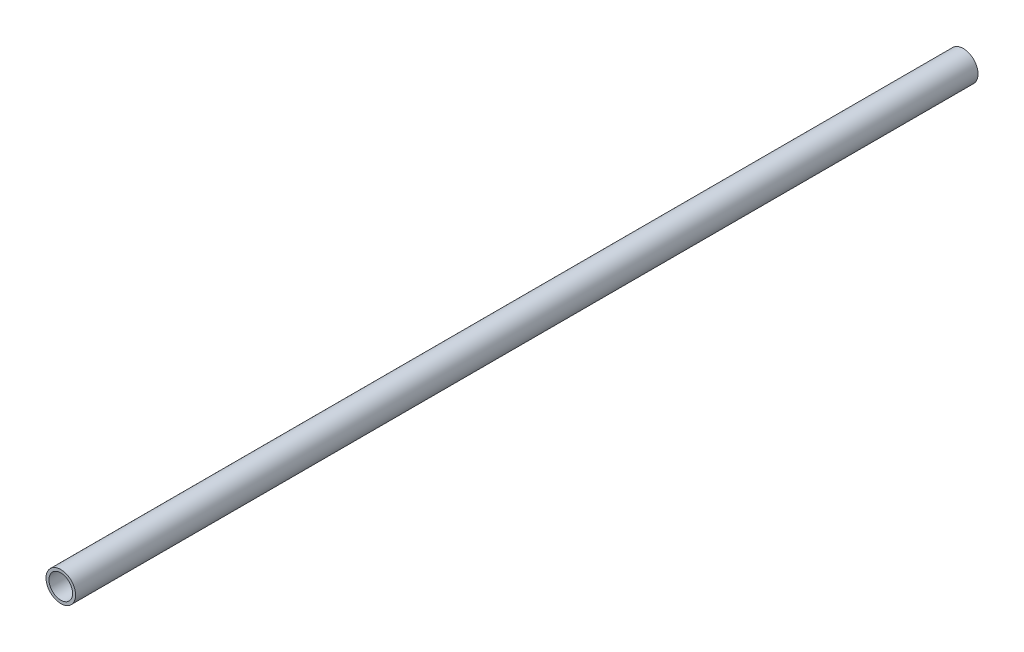
ISO-10303-21;
HEADER;
FILE_DESCRIPTION(('STEP AP214'),'2;1');
FILE_NAME('part.step','',(''),(''),'','','');
FILE_SCHEMA(('AUTOMOTIVE_DESIGN { 1 0 10303 214 1 1 1 1 }'));
ENDSEC;
DATA;
#1=APPLICATION_CONTEXT('core data for automotive mechanical design processes');
#2=APPLICATION_PROTOCOL_DEFINITION('international standard','automotive_design',2000,#1);
#3=PRODUCT_CONTEXT('',#1,'mechanical');
#4=PRODUCT('Part','Part','',(#3));
#5=PRODUCT_RELATED_PRODUCT_CATEGORY('part','',(#4));
#6=PRODUCT_DEFINITION_FORMATION('','',#4);
#7=PRODUCT_DEFINITION_CONTEXT('part definition',#1,'design');
#8=PRODUCT_DEFINITION('design','',#6,#7);
#9=PRODUCT_DEFINITION_SHAPE('','',#8);
#10=(LENGTH_UNIT() NAMED_UNIT(*) SI_UNIT(.MILLI.,.METRE.));
#11=(NAMED_UNIT(*) PLANE_ANGLE_UNIT() SI_UNIT($,.RADIAN.));
#12=(NAMED_UNIT(*) SI_UNIT($,.STERADIAN.) SOLID_ANGLE_UNIT());
#13=UNCERTAINTY_MEASURE_WITH_UNIT(LENGTH_MEASURE(1.E-05),#10,'distance_accuracy_value','');
#14=(GEOMETRIC_REPRESENTATION_CONTEXT(3) GLOBAL_UNCERTAINTY_ASSIGNED_CONTEXT((#13)) GLOBAL_UNIT_ASSIGNED_CONTEXT((#10,
#11,#12)) REPRESENTATION_CONTEXT('',''));
#15=CARTESIAN_POINT('',(0.,0.,0.));
#16=DIRECTION('',(0.,0.,1.));
#17=DIRECTION('',(1.,0.,0.));
#18=AXIS2_PLACEMENT_3D('',#15,#16,#17);
#19=CARTESIAN_POINT('',(0.,0.,458.));
#20=DIRECTION('',(0.,0.,1.));
#21=DIRECTION('',(1.,0.,0.));
#22=AXIS2_PLACEMENT_3D('',#19,#20,#21);
#23=PLANE('',#22);
#24=CARTESIAN_POINT('',(0.,0.,458.));
#25=DIRECTION('',(0.,0.,1.));
#26=DIRECTION('',(1.,0.,0.));
#27=AXIS2_PLACEMENT_3D('',#24,#25,#26);
#28=CIRCLE('',#27,15.);
#29=CARTESIAN_POINT('',(-15.,0.,458.));
#30=VERTEX_POINT('',#29);
#31=EDGE_CURVE('E10',#30,#30,#28,.T.);
#32=ORIENTED_EDGE('',*,*,#31,.T.);
#33=EDGE_LOOP('',(#32));
#34=FACE_BOUND('',#33,.T.);
#35=CARTESIAN_POINT('',(0.,0.,458.));
#36=DIRECTION('',(0.,0.,1.));
#37=DIRECTION('',(1.,0.,0.));
#38=AXIS2_PLACEMENT_3D('',#35,#36,#37);
#39=CIRCLE('',#38,12.);
#40=CARTESIAN_POINT('',(-12.,0.,458.));
#41=VERTEX_POINT('',#40);
#42=EDGE_CURVE('E48',#41,#41,#39,.T.);
#43=ORIENTED_EDGE('',*,*,#42,.F.);
#44=EDGE_LOOP('',(#43));
#45=FACE_BOUND('',#44,.T.);
#46=ADVANCED_FACE('F37',(#34,#45),#23,.T.);
#47=CARTESIAN_POINT('',(0.,0.,-458.));
#48=DIRECTION('',(0.,0.,1.));
#49=DIRECTION('',(1.,0.,0.));
#50=AXIS2_PLACEMENT_3D('',#47,#48,#49);
#51=PLANE('',#50);
#52=CARTESIAN_POINT('',(0.,0.,-458.));
#53=DIRECTION('',(0.,0.,1.));
#54=DIRECTION('',(1.,0.,0.));
#55=AXIS2_PLACEMENT_3D('',#52,#53,#54);
#56=CIRCLE('',#55,15.);
#57=CARTESIAN_POINT('',(-15.,0.,-458.));
#58=VERTEX_POINT('',#57);
#59=EDGE_CURVE('E41',#58,#58,#56,.T.);
#60=ORIENTED_EDGE('',*,*,#59,.F.);
#61=EDGE_LOOP('',(#60));
#62=FACE_BOUND('',#61,.T.);
#63=CARTESIAN_POINT('',(0.,0.,-458.));
#64=DIRECTION('',(0.,0.,1.));
#65=DIRECTION('',(1.,0.,0.));
#66=AXIS2_PLACEMENT_3D('',#63,#64,#65);
#67=CIRCLE('',#66,12.);
#68=CARTESIAN_POINT('',(-12.,0.,-458.));
#69=VERTEX_POINT('',#68);
#70=EDGE_CURVE('E50',#69,#69,#67,.T.);
#71=ORIENTED_EDGE('',*,*,#70,.T.);
#72=EDGE_LOOP('',(#71));
#73=FACE_BOUND('',#72,.T.);
#74=ADVANCED_FACE('F60',(#62,#73),#51,.F.);
#75=CARTESIAN_POINT('',(0.,0.,458.));
#76=DIRECTION('',(0.,0.,-1.));
#77=DIRECTION('',(-1.,0.,0.));
#78=AXIS2_PLACEMENT_3D('',#75,#76,#77);
#79=CYLINDRICAL_SURFACE('',#78,15.);
#80=CARTESIAN_POINT('',(-15.,0.,458.));
#81=CARTESIAN_POINT('',(-15.,0.,448.458333333333));
#82=CARTESIAN_POINT('',(-15.,0.,438.916666666667));
#83=CARTESIAN_POINT('',(-15.,0.,419.833333333333));
#84=CARTESIAN_POINT('',(-15.,0.,410.291666666667));
#85=CARTESIAN_POINT('',(-15.,0.,391.208333333333));
#86=CARTESIAN_POINT('',(-15.,0.,381.666666666667));
#87=CARTESIAN_POINT('',(-15.,0.,362.583333333333));
#88=CARTESIAN_POINT('',(-15.,0.,353.041666666667));
#89=CARTESIAN_POINT('',(-15.,0.,333.958333333333));
#90=CARTESIAN_POINT('',(-15.,0.,324.416666666667));
#91=CARTESIAN_POINT('',(-15.,0.,305.333333333333));
#92=CARTESIAN_POINT('',(-15.,0.,295.791666666667));
#93=CARTESIAN_POINT('',(-15.,0.,276.708333333333));
#94=CARTESIAN_POINT('',(-15.,0.,267.166666666667));
#95=CARTESIAN_POINT('',(-15.,0.,248.083333333333));
#96=CARTESIAN_POINT('',(-15.,0.,238.541666666667));
#97=CARTESIAN_POINT('',(-15.,0.,219.458333333333));
#98=CARTESIAN_POINT('',(-15.,0.,209.916666666667));
#99=CARTESIAN_POINT('',(-15.,0.,190.833333333333));
#100=CARTESIAN_POINT('',(-15.,0.,181.291666666667));
#101=CARTESIAN_POINT('',(-15.,0.,162.208333333333));
#102=CARTESIAN_POINT('',(-15.,0.,152.666666666667));
#103=CARTESIAN_POINT('',(-15.,0.,133.583333333333));
#104=CARTESIAN_POINT('',(-15.,0.,124.041666666667));
#105=CARTESIAN_POINT('',(-15.,0.,104.958333333333));
#106=CARTESIAN_POINT('',(-15.,0.,95.4166666666667));
#107=CARTESIAN_POINT('',(-15.,0.,76.3333333333334));
#108=CARTESIAN_POINT('',(-15.,0.,66.7916666666667));
#109=CARTESIAN_POINT('',(-15.,0.,47.7083333333333));
#110=CARTESIAN_POINT('',(-15.,0.,38.1666666666667));
#111=CARTESIAN_POINT('',(-15.,0.,19.0833333333333));
#112=CARTESIAN_POINT('',(-15.,0.,9.54166666666667));
#113=CARTESIAN_POINT('',(-15.,0.,-9.54166666666667));
#114=CARTESIAN_POINT('',(-15.,0.,-19.0833333333333));
#115=CARTESIAN_POINT('',(-15.,0.,-38.1666666666667));
#116=CARTESIAN_POINT('',(-15.,0.,-47.7083333333333));
#117=CARTESIAN_POINT('',(-15.,0.,-66.7916666666666));
#118=CARTESIAN_POINT('',(-15.,0.,-76.3333333333333));
#119=CARTESIAN_POINT('',(-15.,0.,-95.4166666666666));
#120=CARTESIAN_POINT('',(-15.,0.,-104.958333333333));
#121=CARTESIAN_POINT('',(-15.,0.,-124.041666666667));
#122=CARTESIAN_POINT('',(-15.,0.,-133.583333333333));
#123=CARTESIAN_POINT('',(-15.,0.,-152.666666666667));
#124=CARTESIAN_POINT('',(-15.,0.,-162.208333333333));
#125=CARTESIAN_POINT('',(-15.,0.,-181.291666666667));
#126=CARTESIAN_POINT('',(-15.,0.,-190.833333333333));
#127=CARTESIAN_POINT('',(-15.,0.,-209.916666666667));
#128=CARTESIAN_POINT('',(-15.,0.,-219.458333333333));
#129=CARTESIAN_POINT('',(-15.,0.,-238.541666666667));
#130=CARTESIAN_POINT('',(-15.,0.,-248.083333333333));
#131=CARTESIAN_POINT('',(-15.,0.,-267.166666666667));
#132=CARTESIAN_POINT('',(-15.,0.,-276.708333333333));
#133=CARTESIAN_POINT('',(-15.,0.,-295.791666666667));
#134=CARTESIAN_POINT('',(-15.,0.,-305.333333333333));
#135=CARTESIAN_POINT('',(-15.,0.,-324.416666666667));
#136=CARTESIAN_POINT('',(-15.,0.,-333.958333333333));
#137=CARTESIAN_POINT('',(-15.,0.,-353.041666666667));
#138=CARTESIAN_POINT('',(-15.,0.,-362.583333333333));
#139=CARTESIAN_POINT('',(-15.,0.,-381.666666666667));
#140=CARTESIAN_POINT('',(-15.,0.,-391.208333333333));
#141=CARTESIAN_POINT('',(-15.,0.,-410.291666666667));
#142=CARTESIAN_POINT('',(-15.,0.,-419.833333333333));
#143=CARTESIAN_POINT('',(-15.,0.,-438.916666666667));
#144=CARTESIAN_POINT('',(-15.,0.,-448.458333333333));
#145=CARTESIAN_POINT('',(-15.,0.,-458.));
#146=B_SPLINE_CURVE_WITH_KNOTS('',3,(#80,#81,#82,#83,#84,#85,#86,#87,#88,#89,#90,#91,#92,#93,
#94,#95,#96,#97,#98,#99,#100,#101,#102,#103,#104,#105,#106,#107,#108,#109,#110,#111,#112,#113,
#114,#115,#116,#117,#118,#119,#120,#121,#122,#123,#124,#125,#126,#127,#128,#129,#130,#131,#132,
#133,#134,#135,#136,#137,#138,#139,#140,#141,#142,#143,#144,#145),.UNSPECIFIED.,.F.,.F.,(4,2,2,
2,2,2,2,2,2,2,2,2,2,2,2,2,2,2,2,2,2,2,2,2,2,2,2,2,2,2,2,2,4),(0.,28.625,57.25,85.875,114.5,
143.125,171.75,200.375,229.,257.625,286.25,314.875,343.5,372.125,400.75,429.375,458.,486.625,
515.25,543.875,572.5,601.125,629.75,658.375,687.,715.625,744.25,772.875,801.5,830.125,858.75,
887.375,916.),.UNSPECIFIED.);
#147=EDGE_CURVE('BSEAM39',#30,#58,#146,.T.);
#148=ORIENTED_EDGE('',*,*,#31,.F.);
#149=ORIENTED_EDGE('',*,*,#59,.T.);
#150=ORIENTED_EDGE('',*,*,#147,.T.);
#151=ORIENTED_EDGE('',*,*,#147,.F.);
#152=EDGE_LOOP('',(#148,#150,#149,#151));
#153=FACE_BOUND('',#152,.T.);
#154=ADVANCED_FACE('F39',(#153),#79,.T.);
#155=CARTESIAN_POINT('',(0.,0.,458.));
#156=DIRECTION('',(0.,0.,-1.));
#157=DIRECTION('',(-1.,0.,0.));
#158=AXIS2_PLACEMENT_3D('',#155,#156,#157);
#159=CYLINDRICAL_SURFACE('',#158,12.);
#160=CARTESIAN_POINT('',(-12.,0.,458.));
#161=CARTESIAN_POINT('',(-12.,0.,448.458333333333));
#162=CARTESIAN_POINT('',(-12.,0.,438.916666666667));
#163=CARTESIAN_POINT('',(-12.,0.,419.833333333333));
#164=CARTESIAN_POINT('',(-12.,0.,410.291666666667));
#165=CARTESIAN_POINT('',(-12.,0.,391.208333333333));
#166=CARTESIAN_POINT('',(-12.,0.,381.666666666667));
#167=CARTESIAN_POINT('',(-12.,0.,362.583333333333));
#168=CARTESIAN_POINT('',(-12.,0.,353.041666666667));
#169=CARTESIAN_POINT('',(-12.,0.,333.958333333333));
#170=CARTESIAN_POINT('',(-12.,0.,324.416666666667));
#171=CARTESIAN_POINT('',(-12.,0.,305.333333333333));
#172=CARTESIAN_POINT('',(-12.,0.,295.791666666667));
#173=CARTESIAN_POINT('',(-12.,0.,276.708333333333));
#174=CARTESIAN_POINT('',(-12.,0.,267.166666666667));
#175=CARTESIAN_POINT('',(-12.,0.,248.083333333333));
#176=CARTESIAN_POINT('',(-12.,0.,238.541666666667));
#177=CARTESIAN_POINT('',(-12.,0.,219.458333333333));
#178=CARTESIAN_POINT('',(-12.,0.,209.916666666667));
#179=CARTESIAN_POINT('',(-12.,0.,190.833333333333));
#180=CARTESIAN_POINT('',(-12.,0.,181.291666666667));
#181=CARTESIAN_POINT('',(-12.,0.,162.208333333333));
#182=CARTESIAN_POINT('',(-12.,0.,152.666666666667));
#183=CARTESIAN_POINT('',(-12.,0.,133.583333333333));
#184=CARTESIAN_POINT('',(-12.,0.,124.041666666667));
#185=CARTESIAN_POINT('',(-12.,0.,104.958333333333));
#186=CARTESIAN_POINT('',(-12.,0.,95.4166666666667));
#187=CARTESIAN_POINT('',(-12.,0.,76.3333333333334));
#188=CARTESIAN_POINT('',(-12.,0.,66.7916666666667));
#189=CARTESIAN_POINT('',(-12.,0.,47.7083333333333));
#190=CARTESIAN_POINT('',(-12.,0.,38.1666666666667));
#191=CARTESIAN_POINT('',(-12.,0.,19.0833333333333));
#192=CARTESIAN_POINT('',(-12.,0.,9.54166666666667));
#193=CARTESIAN_POINT('',(-12.,0.,-9.54166666666667));
#194=CARTESIAN_POINT('',(-12.,0.,-19.0833333333333));
#195=CARTESIAN_POINT('',(-12.,0.,-38.1666666666667));
#196=CARTESIAN_POINT('',(-12.,0.,-47.7083333333333));
#197=CARTESIAN_POINT('',(-12.,0.,-66.7916666666666));
#198=CARTESIAN_POINT('',(-12.,0.,-76.3333333333333));
#199=CARTESIAN_POINT('',(-12.,0.,-95.4166666666666));
#200=CARTESIAN_POINT('',(-12.,0.,-104.958333333333));
#201=CARTESIAN_POINT('',(-12.,0.,-124.041666666667));
#202=CARTESIAN_POINT('',(-12.,0.,-133.583333333333));
#203=CARTESIAN_POINT('',(-12.,0.,-152.666666666667));
#204=CARTESIAN_POINT('',(-12.,0.,-162.208333333333));
#205=CARTESIAN_POINT('',(-12.,0.,-181.291666666667));
#206=CARTESIAN_POINT('',(-12.,0.,-190.833333333333));
#207=CARTESIAN_POINT('',(-12.,0.,-209.916666666667));
#208=CARTESIAN_POINT('',(-12.,0.,-219.458333333333));
#209=CARTESIAN_POINT('',(-12.,0.,-238.541666666667));
#210=CARTESIAN_POINT('',(-12.,0.,-248.083333333333));
#211=CARTESIAN_POINT('',(-12.,0.,-267.166666666667));
#212=CARTESIAN_POINT('',(-12.,0.,-276.708333333333));
#213=CARTESIAN_POINT('',(-12.,0.,-295.791666666667));
#214=CARTESIAN_POINT('',(-12.,0.,-305.333333333333));
#215=CARTESIAN_POINT('',(-12.,0.,-324.416666666667));
#216=CARTESIAN_POINT('',(-12.,0.,-333.958333333333));
#217=CARTESIAN_POINT('',(-12.,0.,-353.041666666667));
#218=CARTESIAN_POINT('',(-12.,0.,-362.583333333333));
#219=CARTESIAN_POINT('',(-12.,0.,-381.666666666667));
#220=CARTESIAN_POINT('',(-12.,0.,-391.208333333333));
#221=CARTESIAN_POINT('',(-12.,0.,-410.291666666667));
#222=CARTESIAN_POINT('',(-12.,0.,-419.833333333333));
#223=CARTESIAN_POINT('',(-12.,0.,-438.916666666667));
#224=CARTESIAN_POINT('',(-12.,0.,-448.458333333333));
#225=CARTESIAN_POINT('',(-12.,0.,-458.));
#226=B_SPLINE_CURVE_WITH_KNOTS('',3,(#160,#161,#162,#163,#164,#165,#166,#167,#168,#169,#170,
#171,#172,#173,#174,#175,#176,#177,#178,#179,#180,#181,#182,#183,#184,#185,#186,#187,#188,#189,
#190,#191,#192,#193,#194,#195,#196,#197,#198,#199,#200,#201,#202,#203,#204,#205,#206,#207,#208,
#209,#210,#211,#212,#213,#214,#215,#216,#217,#218,#219,#220,#221,#222,#223,#224,#225),
.UNSPECIFIED.,.F.,.F.,(4,2,2,2,2,2,2,2,2,2,2,2,2,2,2,2,2,2,2,2,2,2,2,2,2,2,2,2,2,2,2,2,4),(0.,
28.625,57.25,85.875,114.5,143.125,171.75,200.375,229.,257.625,286.25,314.875,343.5,372.125,
400.75,429.375,458.,486.625,515.25,543.875,572.5,601.125,629.75,658.375,687.,715.625,744.25,
772.875,801.5,830.125,858.75,887.375,916.),.UNSPECIFIED.);
#227=EDGE_CURVE('BSEAM56',#41,#69,#226,.T.);
#228=ORIENTED_EDGE('',*,*,#42,.T.);
#229=ORIENTED_EDGE('',*,*,#70,.F.);
#230=ORIENTED_EDGE('',*,*,#227,.T.);
#231=ORIENTED_EDGE('',*,*,#227,.F.);
#232=EDGE_LOOP('',(#228,#230,#229,#231));
#233=FACE_BOUND('',#232,.T.);
#234=ADVANCED_FACE('F56',(#233),#159,.F.);
#235=CLOSED_SHELL('',(#46,#74,#154,#234));
#236=MANIFOLD_SOLID_BREP('B2',#235);
#237=ADVANCED_BREP_SHAPE_REPRESENTATION('',(#18,#236),#14);
#238=SHAPE_DEFINITION_REPRESENTATION(#9,#237);
ENDSEC;
END-ISO-10303-21;
